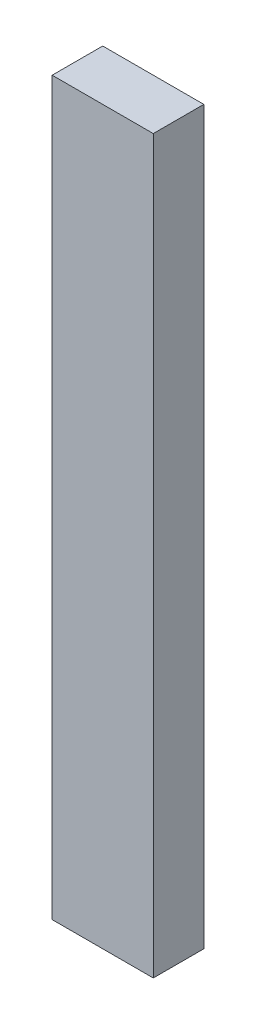
ISO-10303-21;
HEADER;
FILE_DESCRIPTION(('STEP AP214'),'2;1');
FILE_NAME('part.step','',(''),(''),'','','');
FILE_SCHEMA(('AUTOMOTIVE_DESIGN { 1 0 10303 214 1 1 1 1 }'));
ENDSEC;
DATA;
#1=APPLICATION_CONTEXT('core data for automotive mechanical design processes');
#2=APPLICATION_PROTOCOL_DEFINITION('international standard','automotive_design',2000,#1);
#3=PRODUCT_CONTEXT('',#1,'mechanical');
#4=PRODUCT('Part','Part','',(#3));
#5=PRODUCT_RELATED_PRODUCT_CATEGORY('part','',(#4));
#6=PRODUCT_DEFINITION_FORMATION('','',#4);
#7=PRODUCT_DEFINITION_CONTEXT('part definition',#1,'design');
#8=PRODUCT_DEFINITION('design','',#6,#7);
#9=PRODUCT_DEFINITION_SHAPE('','',#8);
#10=(LENGTH_UNIT() NAMED_UNIT(*) SI_UNIT(.MILLI.,.METRE.));
#11=(NAMED_UNIT(*) PLANE_ANGLE_UNIT() SI_UNIT($,.RADIAN.));
#12=(NAMED_UNIT(*) SI_UNIT($,.STERADIAN.) SOLID_ANGLE_UNIT());
#13=UNCERTAINTY_MEASURE_WITH_UNIT(LENGTH_MEASURE(1.E-05),#10,'distance_accuracy_value','');
#14=(GEOMETRIC_REPRESENTATION_CONTEXT(3) GLOBAL_UNCERTAINTY_ASSIGNED_CONTEXT((#13)) GLOBAL_UNIT_ASSIGNED_CONTEXT((#10,
#11,#12)) REPRESENTATION_CONTEXT('',''));
#15=CARTESIAN_POINT('',(0.,0.,0.));
#16=DIRECTION('',(0.,0.,1.));
#17=DIRECTION('',(1.,0.,0.));
#18=AXIS2_PLACEMENT_3D('',#15,#16,#17);
#19=CARTESIAN_POINT('',(-40.1688311688312,217.,-6.87662337662338));
#20=DIRECTION('',(1.,0.,0.));
#21=DIRECTION('',(0.,0.,-1.));
#22=AXIS2_PLACEMENT_3D('',#19,#20,#21);
#23=PLANE('',#22);
#24=DIRECTION('',(0.,0.,1.));
#25=VECTOR('',#24,1.);
#26=CARTESIAN_POINT('',(-40.1688311688312,0.,-6.87662337662338));
#27=LINE('',#26,#25);
#28=CARTESIAN_POINT('',(-40.1688311688312,0.,-6.87662337662338));
#29=VERTEX_POINT('',#28);
#30=CARTESIAN_POINT('',(-40.1688311688312,0.,8.12337662337662));
#31=VERTEX_POINT('',#30);
#32=EDGE_CURVE('E104',#29,#31,#27,.T.);
#33=ORIENTED_EDGE('',*,*,#32,.T.);
#34=DIRECTION('',(0.,-1.,0.));
#35=VECTOR('',#34,1.);
#36=CARTESIAN_POINT('',(-40.1688311688312,217.,8.12337662337662));
#37=LINE('',#36,#35);
#38=CARTESIAN_POINT('',(-40.1688311688312,217.,8.12337662337662));
#39=VERTEX_POINT('',#38);
#40=EDGE_CURVE('E11',#39,#31,#37,.T.);
#41=ORIENTED_EDGE('',*,*,#40,.F.);
#42=DIRECTION('',(0.,0.,1.));
#43=VECTOR('',#42,1.);
#44=CARTESIAN_POINT('',(-40.1688311688312,217.,-6.87662337662338));
#45=LINE('',#44,#43);
#46=CARTESIAN_POINT('',(-40.1688311688312,217.,-6.87662337662338));
#47=VERTEX_POINT('',#46);
#48=EDGE_CURVE('E92',#47,#39,#45,.T.);
#49=ORIENTED_EDGE('',*,*,#48,.F.);
#50=DIRECTION('',(0.,-1.,0.));
#51=VECTOR('',#50,1.);
#52=CARTESIAN_POINT('',(-40.1688311688312,217.,-6.87662337662338));
#53=LINE('',#52,#51);
#54=EDGE_CURVE('E100',#47,#29,#53,.T.);
#55=ORIENTED_EDGE('',*,*,#54,.T.);
#56=EDGE_LOOP('',(#33,#41,#49,#55));
#57=FACE_BOUND('',#56,.T.);
#58=ADVANCED_FACE('F41',(#57),#23,.F.);
#59=CARTESIAN_POINT('',(-40.1688311688312,217.,8.12337662337662));
#60=DIRECTION('',(0.,0.,-1.));
#61=DIRECTION('',(-1.,0.,0.));
#62=AXIS2_PLACEMENT_3D('',#59,#60,#61);
#63=PLANE('',#62);
#64=DIRECTION('',(1.,0.,0.));
#65=VECTOR('',#64,1.);
#66=CARTESIAN_POINT('',(-40.1688311688312,0.,8.12337662337662));
#67=LINE('',#66,#65);
#68=CARTESIAN_POINT('',(-10.1688311688312,0.,8.12337662337662));
#69=VERTEX_POINT('',#68);
#70=EDGE_CURVE('E96',#31,#69,#67,.T.);
#71=ORIENTED_EDGE('',*,*,#70,.T.);
#72=DIRECTION('',(0.,-1.,0.));
#73=VECTOR('',#72,1.);
#74=CARTESIAN_POINT('',(-10.1688311688312,217.,8.12337662337662));
#75=LINE('',#74,#73);
#76=CARTESIAN_POINT('',(-10.1688311688312,217.,8.12337662337662));
#77=VERTEX_POINT('',#76);
#78=EDGE_CURVE('E49',#77,#69,#75,.T.);
#79=ORIENTED_EDGE('',*,*,#78,.F.);
#80=DIRECTION('',(1.,0.,0.));
#81=VECTOR('',#80,1.);
#82=CARTESIAN_POINT('',(-40.1688311688312,217.,8.12337662337662));
#83=LINE('',#82,#81);
#84=EDGE_CURVE('E87',#39,#77,#83,.T.);
#85=ORIENTED_EDGE('',*,*,#84,.F.);
#86=ORIENTED_EDGE('',*,*,#40,.T.);
#87=EDGE_LOOP('',(#71,#79,#85,#86));
#88=FACE_BOUND('',#87,.T.);
#89=ADVANCED_FACE('F95',(#88),#63,.F.);
#90=CARTESIAN_POINT('',(-10.1688311688312,217.,-6.87662337662338));
#91=DIRECTION('',(-1.,0.,0.));
#92=DIRECTION('',(0.,0.,1.));
#93=AXIS2_PLACEMENT_3D('',#90,#91,#92);
#94=PLANE('',#93);
#95=DIRECTION('',(0.,0.,-1.));
#96=VECTOR('',#95,1.);
#97=CARTESIAN_POINT('',(-10.1688311688312,0.,-6.87662337662338));
#98=LINE('',#97,#96);
#99=CARTESIAN_POINT('',(-10.1688311688312,0.,-6.87662337662338));
#100=VERTEX_POINT('',#99);
#101=EDGE_CURVE('E74',#69,#100,#98,.T.);
#102=ORIENTED_EDGE('',*,*,#101,.T.);
#103=DIRECTION('',(0.,-1.,0.));
#104=VECTOR('',#103,1.);
#105=CARTESIAN_POINT('',(-10.1688311688312,217.,-6.87662337662338));
#106=LINE('',#105,#104);
#107=CARTESIAN_POINT('',(-10.1688311688312,217.,-6.87662337662338));
#108=VERTEX_POINT('',#107);
#109=EDGE_CURVE('E97',#108,#100,#106,.T.);
#110=ORIENTED_EDGE('',*,*,#109,.F.);
#111=DIRECTION('',(0.,0.,-1.));
#112=VECTOR('',#111,1.);
#113=CARTESIAN_POINT('',(-10.1688311688312,217.,-6.87662337662338));
#114=LINE('',#113,#112);
#115=EDGE_CURVE('E90',#77,#108,#114,.T.);
#116=ORIENTED_EDGE('',*,*,#115,.F.);
#117=ORIENTED_EDGE('',*,*,#78,.T.);
#118=EDGE_LOOP('',(#102,#110,#116,#117));
#119=FACE_BOUND('',#118,.T.);
#120=ADVANCED_FACE('F98',(#119),#94,.F.);
#121=CARTESIAN_POINT('',(-40.1688311688312,217.,-6.87662337662338));
#122=DIRECTION('',(0.,0.,1.));
#123=DIRECTION('',(1.,0.,0.));
#124=AXIS2_PLACEMENT_3D('',#121,#122,#123);
#125=PLANE('',#124);
#126=DIRECTION('',(-1.,0.,0.));
#127=VECTOR('',#126,1.);
#128=CARTESIAN_POINT('',(-40.1688311688312,0.,-6.87662337662338));
#129=LINE('',#128,#127);
#130=EDGE_CURVE('E80',#100,#29,#129,.T.);
#131=ORIENTED_EDGE('',*,*,#130,.T.);
#132=ORIENTED_EDGE('',*,*,#54,.F.);
#133=DIRECTION('',(-1.,0.,0.));
#134=VECTOR('',#133,1.);
#135=CARTESIAN_POINT('',(-40.1688311688312,217.,-6.87662337662338));
#136=LINE('',#135,#134);
#137=EDGE_CURVE('E57',#108,#47,#136,.T.);
#138=ORIENTED_EDGE('',*,*,#137,.F.);
#139=ORIENTED_EDGE('',*,*,#109,.T.);
#140=EDGE_LOOP('',(#131,#132,#138,#139));
#141=FACE_BOUND('',#140,.T.);
#142=ADVANCED_FACE('F111',(#141),#125,.F.);
#143=CARTESIAN_POINT('',(0.,217.,0.));
#144=DIRECTION('',(0.,1.,0.));
#145=DIRECTION('',(0.,0.,1.));
#146=AXIS2_PLACEMENT_3D('',#143,#144,#145);
#147=PLANE('',#146);
#148=ORIENTED_EDGE('',*,*,#48,.T.);
#149=ORIENTED_EDGE('',*,*,#84,.T.);
#150=ORIENTED_EDGE('',*,*,#115,.T.);
#151=ORIENTED_EDGE('',*,*,#137,.T.);
#152=EDGE_LOOP('',(#148,#149,#150,#151));
#153=FACE_BOUND('',#152,.T.);
#154=ADVANCED_FACE('F88',(#153),#147,.T.);
#155=CARTESIAN_POINT('',(0.,0.,0.));
#156=DIRECTION('',(0.,1.,0.));
#157=DIRECTION('',(0.,0.,1.));
#158=AXIS2_PLACEMENT_3D('',#155,#156,#157);
#159=PLANE('',#158);
#160=ORIENTED_EDGE('',*,*,#32,.F.);
#161=ORIENTED_EDGE('',*,*,#130,.F.);
#162=ORIENTED_EDGE('',*,*,#101,.F.);
#163=ORIENTED_EDGE('',*,*,#70,.F.);
#164=EDGE_LOOP('',(#160,#161,#162,#163));
#165=FACE_BOUND('',#164,.T.);
#166=ADVANCED_FACE('F114',(#165),#159,.F.);
#167=CLOSED_SHELL('',(#58,#89,#120,#142,#154,#166));
#168=MANIFOLD_SOLID_BREP('B2',#167);
#169=ADVANCED_BREP_SHAPE_REPRESENTATION('',(#18,#168),#14);
#170=SHAPE_DEFINITION_REPRESENTATION(#9,#169);
ENDSEC;
END-ISO-10303-21;
